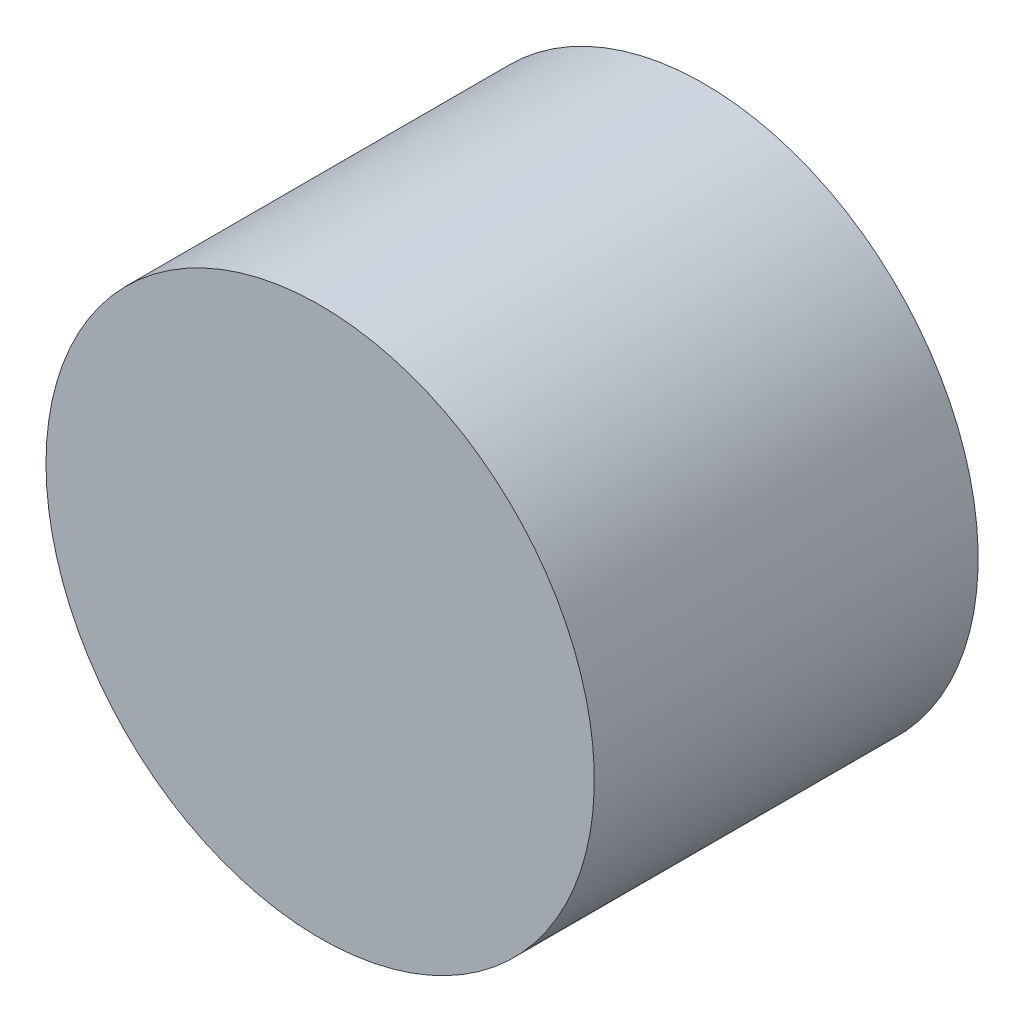
ISO-10303-21;
HEADER;
FILE_DESCRIPTION(('STEP AP214'),'2;1');
FILE_NAME('part.step','',(''),(''),'','','');
FILE_SCHEMA(('AUTOMOTIVE_DESIGN { 1 0 10303 214 1 1 1 1 }'));
ENDSEC;
DATA;
#1=APPLICATION_CONTEXT('core data for automotive mechanical design processes');
#2=APPLICATION_PROTOCOL_DEFINITION('international standard','automotive_design',2000,#1);
#3=PRODUCT_CONTEXT('',#1,'mechanical');
#4=PRODUCT('Part','Part','',(#3));
#5=PRODUCT_RELATED_PRODUCT_CATEGORY('part','',(#4));
#6=PRODUCT_DEFINITION_FORMATION('','',#4);
#7=PRODUCT_DEFINITION_CONTEXT('part definition',#1,'design');
#8=PRODUCT_DEFINITION('design','',#6,#7);
#9=PRODUCT_DEFINITION_SHAPE('','',#8);
#10=(LENGTH_UNIT() NAMED_UNIT(*) SI_UNIT(.MILLI.,.METRE.));
#11=(NAMED_UNIT(*) PLANE_ANGLE_UNIT() SI_UNIT($,.RADIAN.));
#12=(NAMED_UNIT(*) SI_UNIT($,.STERADIAN.) SOLID_ANGLE_UNIT());
#13=UNCERTAINTY_MEASURE_WITH_UNIT(LENGTH_MEASURE(1.E-05),#10,'distance_accuracy_value','');
#14=(GEOMETRIC_REPRESENTATION_CONTEXT(3) GLOBAL_UNCERTAINTY_ASSIGNED_CONTEXT((#13)) GLOBAL_UNIT_ASSIGNED_CONTEXT((#10,
#11,#12)) REPRESENTATION_CONTEXT('',''));
#15=CARTESIAN_POINT('',(0.,0.,0.));
#16=DIRECTION('',(0.,0.,1.));
#17=DIRECTION('',(1.,0.,0.));
#18=AXIS2_PLACEMENT_3D('',#15,#16,#17);
#19=CARTESIAN_POINT('',(0.,0.,21.));
#20=DIRECTION('',(0.,0.,-1.));
#21=DIRECTION('',(-1.,0.,0.));
#22=AXIS2_PLACEMENT_3D('',#19,#20,#21);
#23=CYLINDRICAL_SURFACE('',#22,15.);
#24=CARTESIAN_POINT('',(0.,0.,21.));
#25=DIRECTION('',(0.,0.,1.));
#26=DIRECTION('',(1.,0.,0.));
#27=AXIS2_PLACEMENT_3D('',#24,#25,#26);
#28=CIRCLE('',#27,15.);
#29=CARTESIAN_POINT('',(-15.,0.,21.));
#30=VERTEX_POINT('',#29);
#31=EDGE_CURVE('E10',#30,#30,#28,.T.);
#32=CARTESIAN_POINT('',(0.,0.,0.));
#33=DIRECTION('',(0.,0.,1.));
#34=DIRECTION('',(1.,0.,0.));
#35=AXIS2_PLACEMENT_3D('',#32,#33,#34);
#36=CIRCLE('',#35,15.);
#37=CARTESIAN_POINT('',(-15.,0.,0.));
#38=VERTEX_POINT('',#37);
#39=EDGE_CURVE('E46',#38,#38,#36,.T.);
#40=CARTESIAN_POINT('',(-15.,0.,21.));
#41=CARTESIAN_POINT('',(-15.,0.,20.78125));
#42=CARTESIAN_POINT('',(-15.,0.,20.5625));
#43=CARTESIAN_POINT('',(-15.,0.,20.125));
#44=CARTESIAN_POINT('',(-15.,0.,19.90625));
#45=CARTESIAN_POINT('',(-15.,0.,19.46875));
#46=CARTESIAN_POINT('',(-15.,0.,19.25));
#47=CARTESIAN_POINT('',(-15.,0.,18.8125));
#48=CARTESIAN_POINT('',(-15.,0.,18.59375));
#49=CARTESIAN_POINT('',(-15.,0.,18.15625));
#50=CARTESIAN_POINT('',(-15.,0.,17.9375));
#51=CARTESIAN_POINT('',(-15.,0.,17.5));
#52=CARTESIAN_POINT('',(-15.,0.,17.28125));
#53=CARTESIAN_POINT('',(-15.,0.,16.84375));
#54=CARTESIAN_POINT('',(-15.,0.,16.625));
#55=CARTESIAN_POINT('',(-15.,0.,16.1875));
#56=CARTESIAN_POINT('',(-15.,0.,15.96875));
#57=CARTESIAN_POINT('',(-15.,0.,15.53125));
#58=CARTESIAN_POINT('',(-15.,0.,15.3125));
#59=CARTESIAN_POINT('',(-15.,0.,14.875));
#60=CARTESIAN_POINT('',(-15.,0.,14.65625));
#61=CARTESIAN_POINT('',(-15.,0.,14.21875));
#62=CARTESIAN_POINT('',(-15.,0.,14.));
#63=CARTESIAN_POINT('',(-15.,0.,13.5625));
#64=CARTESIAN_POINT('',(-15.,0.,13.34375));
#65=CARTESIAN_POINT('',(-15.,0.,12.90625));
#66=CARTESIAN_POINT('',(-15.,0.,12.6875));
#67=CARTESIAN_POINT('',(-15.,0.,12.25));
#68=CARTESIAN_POINT('',(-15.,0.,12.03125));
#69=CARTESIAN_POINT('',(-15.,0.,11.59375));
#70=CARTESIAN_POINT('',(-15.,0.,11.375));
#71=CARTESIAN_POINT('',(-15.,0.,10.9375));
#72=CARTESIAN_POINT('',(-15.,0.,10.71875));
#73=CARTESIAN_POINT('',(-15.,0.,10.28125));
#74=CARTESIAN_POINT('',(-15.,0.,10.0625));
#75=CARTESIAN_POINT('',(-15.,0.,9.625));
#76=CARTESIAN_POINT('',(-15.,0.,9.40625));
#77=CARTESIAN_POINT('',(-15.,0.,8.96875));
#78=CARTESIAN_POINT('',(-15.,0.,8.75));
#79=CARTESIAN_POINT('',(-15.,0.,8.3125));
#80=CARTESIAN_POINT('',(-15.,0.,8.09375));
#81=CARTESIAN_POINT('',(-15.,0.,7.65625));
#82=CARTESIAN_POINT('',(-15.,0.,7.4375));
#83=CARTESIAN_POINT('',(-15.,0.,7.));
#84=CARTESIAN_POINT('',(-15.,0.,6.78125));
#85=CARTESIAN_POINT('',(-15.,0.,6.34375));
#86=CARTESIAN_POINT('',(-15.,0.,6.125));
#87=CARTESIAN_POINT('',(-15.,0.,5.6875));
#88=CARTESIAN_POINT('',(-15.,0.,5.46875));
#89=CARTESIAN_POINT('',(-15.,0.,5.03125));
#90=CARTESIAN_POINT('',(-15.,0.,4.8125));
#91=CARTESIAN_POINT('',(-15.,0.,4.375));
#92=CARTESIAN_POINT('',(-15.,0.,4.15625));
#93=CARTESIAN_POINT('',(-15.,0.,3.71875));
#94=CARTESIAN_POINT('',(-15.,0.,3.5));
#95=CARTESIAN_POINT('',(-15.,0.,3.0625));
#96=CARTESIAN_POINT('',(-15.,0.,2.84375));
#97=CARTESIAN_POINT('',(-15.,0.,2.40625));
#98=CARTESIAN_POINT('',(-15.,0.,2.1875));
#99=CARTESIAN_POINT('',(-15.,0.,1.75));
#100=CARTESIAN_POINT('',(-15.,0.,1.53125));
#101=CARTESIAN_POINT('',(-15.,0.,1.09375));
#102=CARTESIAN_POINT('',(-15.,0.,0.875000000000001));
#103=CARTESIAN_POINT('',(-15.,0.,0.4375));
#104=CARTESIAN_POINT('',(-15.,0.,0.21875));
#105=CARTESIAN_POINT('',(-15.,0.,0.));
#106=B_SPLINE_CURVE_WITH_KNOTS('',3,(#40,#41,#42,#43,#44,#45,#46,#47,#48,#49,#50,#51,#52,#53,
#54,#55,#56,#57,#58,#59,#60,#61,#62,#63,#64,#65,#66,#67,#68,#69,#70,#71,#72,#73,#74,#75,#76,#77,
#78,#79,#80,#81,#82,#83,#84,#85,#86,#87,#88,#89,#90,#91,#92,#93,#94,#95,#96,#97,#98,#99,#100,
#101,#102,#103,#104,#105),.UNSPECIFIED.,.F.,.F.,(4,2,2,2,2,2,2,2,2,2,2,2,2,2,2,2,2,2,2,2,2,2,2,
2,2,2,2,2,2,2,2,2,4),(0.,0.656250000000001,1.3125,1.96875,2.625,3.28125,3.9375,4.59375,5.25,
5.90625,6.5625,7.21875,7.875,8.53125,9.1875,9.84375,10.5,11.15625,11.8125,12.46875,13.125,
13.78125,14.4375,15.09375,15.75,16.40625,17.0625,17.71875,18.375,19.03125,19.6875,20.34375,21.),.UNSPECIFIED.);
#107=EDGE_CURVE('BSEAM43',#30,#38,#106,.T.);
#108=ORIENTED_EDGE('',*,*,#31,.F.);
#109=ORIENTED_EDGE('',*,*,#39,.T.);
#110=ORIENTED_EDGE('',*,*,#107,.T.);
#111=ORIENTED_EDGE('',*,*,#107,.F.);
#112=EDGE_LOOP('',(#108,#110,#109,#111));
#113=FACE_BOUND('',#112,.T.);
#114=ADVANCED_FACE('F43',(#113),#23,.T.);
#115=CARTESIAN_POINT('',(0.,0.,21.));
#116=DIRECTION('',(0.,0.,1.));
#117=DIRECTION('',(1.,0.,0.));
#118=AXIS2_PLACEMENT_3D('',#115,#116,#117);
#119=PLANE('',#118);
#120=ORIENTED_EDGE('',*,*,#31,.T.);
#121=EDGE_LOOP('',(#120));
#122=FACE_BOUND('',#121,.T.);
#123=ADVANCED_FACE('F76',(#122),#119,.T.);
#124=CARTESIAN_POINT('',(0.,0.,0.));
#125=DIRECTION('',(0.,0.,1.));
#126=DIRECTION('',(1.,0.,0.));
#127=AXIS2_PLACEMENT_3D('',#124,#125,#126);
#128=PLANE('',#127);
#129=CARTESIAN_POINT('',(0.,0.,0.));
#130=DIRECTION('',(0.,0.,-1.));
#131=DIRECTION('',(-1.,0.,0.));
#132=AXIS2_PLACEMENT_3D('',#129,#130,#131);
#133=CIRCLE('',#132,2.);
#134=CARTESIAN_POINT('',(-2.,0.,0.));
#135=VERTEX_POINT('',#134);
#136=EDGE_CURVE('E57',#135,#135,#133,.T.);
#137=ORIENTED_EDGE('',*,*,#136,.F.);
#138=EDGE_LOOP('',(#137));
#139=FACE_BOUND('',#138,.T.);
#140=ORIENTED_EDGE('',*,*,#39,.F.);
#141=EDGE_LOOP('',(#140));
#142=FACE_BOUND('',#141,.T.);
#143=ADVANCED_FACE('F70',(#139,#142),#128,.F.);
#144=CARTESIAN_POINT('',(0.,0.,10.));
#145=DIRECTION('',(0.,0.,-1.));
#146=DIRECTION('',(-1.,0.,0.));
#147=AXIS2_PLACEMENT_3D('',#144,#145,#146);
#148=CYLINDRICAL_SURFACE('',#147,2.);
#149=CARTESIAN_POINT('',(0.,0.,10.));
#150=DIRECTION('',(0.,0.,-1.));
#151=DIRECTION('',(-1.,0.,0.));
#152=AXIS2_PLACEMENT_3D('',#149,#150,#151);
#153=CIRCLE('',#152,2.);
#154=CARTESIAN_POINT('',(-2.,0.,10.));
#155=VERTEX_POINT('',#154);
#156=EDGE_CURVE('E55',#155,#155,#153,.T.);
#157=ORIENTED_EDGE('',*,*,#156,.F.);
#158=EDGE_LOOP('',(#157));
#159=FACE_BOUND('',#158,.T.);
#160=ORIENTED_EDGE('',*,*,#136,.T.);
#161=EDGE_LOOP('',(#160));
#162=FACE_BOUND('',#161,.T.);
#163=ADVANCED_FACE('F67',(#159,#162),#148,.F.);
#164=CARTESIAN_POINT('',(0.,0.,10.));
#165=DIRECTION('',(0.,0.,-1.));
#166=DIRECTION('',(-1.,0.,0.));
#167=AXIS2_PLACEMENT_3D('',#164,#165,#166);
#168=PLANE('',#167);
#169=ORIENTED_EDGE('',*,*,#156,.T.);
#170=EDGE_LOOP('',(#169));
#171=FACE_BOUND('',#170,.T.);
#172=ADVANCED_FACE('F65',(#171),#168,.T.);
#173=CLOSED_SHELL('',(#114,#123,#143,#163,#172));
#174=MANIFOLD_SOLID_BREP('B2',#173);
#175=ADVANCED_BREP_SHAPE_REPRESENTATION('',(#18,#174),#14);
#176=SHAPE_DEFINITION_REPRESENTATION(#9,#175);
ENDSEC;
END-ISO-10303-21;
